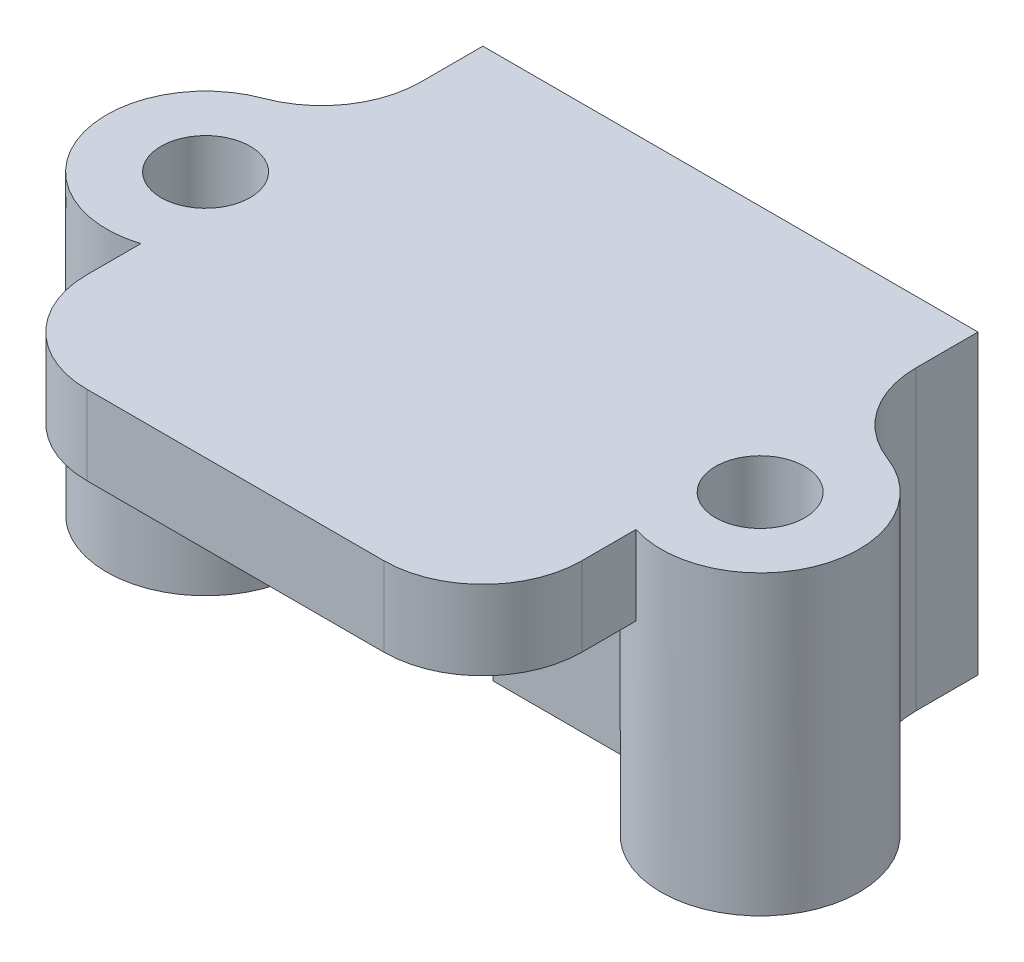
ISO-10303-21;
HEADER;
FILE_DESCRIPTION(('STEP AP214'),'2;1');
FILE_NAME('part.step','',(''),(''),'','','');
FILE_SCHEMA(('AUTOMOTIVE_DESIGN { 1 0 10303 214 1 1 1 1 }'));
ENDSEC;
DATA;
#1=APPLICATION_CONTEXT('core data for automotive mechanical design processes');
#2=APPLICATION_PROTOCOL_DEFINITION('international standard','automotive_design',2000,#1);
#3=PRODUCT_CONTEXT('',#1,'mechanical');
#4=PRODUCT('Part','Part','',(#3));
#5=PRODUCT_RELATED_PRODUCT_CATEGORY('part','',(#4));
#6=PRODUCT_DEFINITION_FORMATION('','',#4);
#7=PRODUCT_DEFINITION_CONTEXT('part definition',#1,'design');
#8=PRODUCT_DEFINITION('design','',#6,#7);
#9=PRODUCT_DEFINITION_SHAPE('','',#8);
#10=(LENGTH_UNIT() NAMED_UNIT(*) SI_UNIT(.MILLI.,.METRE.));
#11=(NAMED_UNIT(*) PLANE_ANGLE_UNIT() SI_UNIT($,.RADIAN.));
#12=(NAMED_UNIT(*) SI_UNIT($,.STERADIAN.) SOLID_ANGLE_UNIT());
#13=UNCERTAINTY_MEASURE_WITH_UNIT(LENGTH_MEASURE(1.E-05),#10,'distance_accuracy_value','');
#14=(GEOMETRIC_REPRESENTATION_CONTEXT(3) GLOBAL_UNCERTAINTY_ASSIGNED_CONTEXT((#13)) GLOBAL_UNIT_ASSIGNED_CONTEXT((#10,
#11,#12)) REPRESENTATION_CONTEXT('',''));
#15=CARTESIAN_POINT('',(0.,0.,0.));
#16=DIRECTION('',(0.,0.,1.));
#17=DIRECTION('',(1.,0.,0.));
#18=AXIS2_PLACEMENT_3D('',#15,#16,#17);
#19=CARTESIAN_POINT('',(-14.,-15.,0.));
#20=DIRECTION('',(0.,1.,0.));
#21=DIRECTION('',(0.,0.,1.));
#22=AXIS2_PLACEMENT_3D('',#19,#20,#21);
#23=CYLINDRICAL_SURFACE('',#22,5.);
#24=CARTESIAN_POINT('',(-14.,0.,0.));
#25=DIRECTION('',(0.,1.,0.));
#26=DIRECTION('',(0.,0.,1.));
#27=AXIS2_PLACEMENT_3D('',#24,#25,#26);
#28=CIRCLE('',#27,5.);
#29=CARTESIAN_POINT('',(-15.75,0.,-4.6837484987988));
#30=VERTEX_POINT('',#29);
#31=CARTESIAN_POINT('',(-12.5,0.,4.76969600708473));
#32=VERTEX_POINT('',#31);
#33=EDGE_CURVE('E283',#30,#32,#28,.T.);
#34=ORIENTED_EDGE('',*,*,#33,.F.);
#35=DIRECTION('',(0.,1.,0.));
#36=VECTOR('',#35,1.);
#37=CARTESIAN_POINT('',(-15.75,-15.,-4.6837484987988));
#38=LINE('',#37,#36);
#39=CARTESIAN_POINT('',(-15.75,-15.,-4.6837484987988));
#40=VERTEX_POINT('',#39);
#41=EDGE_CURVE('E48',#30,#40,#38,.F.);
#42=ORIENTED_EDGE('',*,*,#41,.T.);
#43=CARTESIAN_POINT('',(-14.,-15.,0.));
#44=DIRECTION('',(0.,1.,0.));
#45=DIRECTION('',(0.,0.,1.));
#46=AXIS2_PLACEMENT_3D('',#43,#44,#45);
#47=CIRCLE('',#46,5.);
#48=CARTESIAN_POINT('',(-9.,-15.,0.));
#49=VERTEX_POINT('',#48);
#50=EDGE_CURVE('E284',#40,#49,#47,.T.);
#51=ORIENTED_EDGE('',*,*,#50,.T.);
#52=DIRECTION('',(0.,1.,0.));
#53=VECTOR('',#52,1.);
#54=CARTESIAN_POINT('',(-9.,-15.,0.));
#55=LINE('',#54,#53);
#56=CARTESIAN_POINT('',(-9.,-5.5,0.));
#57=VERTEX_POINT('',#56);
#58=EDGE_CURVE('E269',#49,#57,#55,.T.);
#59=ORIENTED_EDGE('',*,*,#58,.T.);
#60=CARTESIAN_POINT('',(-14.,-5.5,0.));
#61=DIRECTION('',(0.,-1.,0.));
#62=DIRECTION('',(0.,0.,-1.));
#63=AXIS2_PLACEMENT_3D('',#60,#61,#62);
#64=CIRCLE('',#63,5.);
#65=CARTESIAN_POINT('',(-11.,-5.5,4.));
#66=VERTEX_POINT('',#65);
#67=EDGE_CURVE('E217',#66,#57,#64,.F.);
#68=ORIENTED_EDGE('',*,*,#67,.F.);
#69=DIRECTION('',(0.,1.,0.));
#70=VECTOR('',#69,1.);
#71=CARTESIAN_POINT('',(-11.,-15.,4.));
#72=LINE('',#71,#70);
#73=CARTESIAN_POINT('',(-11.,-4.,4.));
#74=VERTEX_POINT('',#73);
#75=EDGE_CURVE('E325',#66,#74,#72,.T.);
#76=ORIENTED_EDGE('',*,*,#75,.T.);
#77=CARTESIAN_POINT('',(-14.,-4.,0.));
#78=DIRECTION('',(0.,1.,0.));
#79=DIRECTION('',(0.,0.,1.));
#80=AXIS2_PLACEMENT_3D('',#77,#78,#79);
#81=CIRCLE('',#80,5.);
#82=CARTESIAN_POINT('',(-12.5,-4.,4.76969600708473));
#83=VERTEX_POINT('',#82);
#84=EDGE_CURVE('E286',#83,#74,#81,.T.);
#85=ORIENTED_EDGE('',*,*,#84,.F.);
#86=DIRECTION('',(0.,1.,0.));
#87=VECTOR('',#86,1.);
#88=CARTESIAN_POINT('',(-12.5,-15.,4.76969600708473));
#89=LINE('',#88,#87);
#90=EDGE_CURVE('E291',#32,#83,#89,.F.);
#91=ORIENTED_EDGE('',*,*,#90,.F.);
#92=EDGE_LOOP('',(#34,#42,#51,#59,#68,#76,#85,#91));
#93=FACE_BOUND('',#92,.T.);
#94=ADVANCED_FACE('F33',(#93),#23,.T.);
#95=CARTESIAN_POINT('',(14.,-15.,0.));
#96=DIRECTION('',(0.,1.,0.));
#97=DIRECTION('',(0.,0.,1.));
#98=AXIS2_PLACEMENT_3D('',#95,#96,#97);
#99=CYLINDRICAL_SURFACE('',#98,4.99999999999999);
#100=CARTESIAN_POINT('',(14.,-15.,0.));
#101=DIRECTION('',(0.,1.,0.));
#102=DIRECTION('',(0.,0.,1.));
#103=AXIS2_PLACEMENT_3D('',#100,#101,#102);
#104=CIRCLE('',#103,4.99999999999999);
#105=CARTESIAN_POINT('',(9.00000000000001,-15.,0.));
#106=VERTEX_POINT('',#105);
#107=CARTESIAN_POINT('',(15.75,-15.,-4.68374849879879));
#108=VERTEX_POINT('',#107);
#109=EDGE_CURVE('E273',#106,#108,#104,.T.);
#110=ORIENTED_EDGE('',*,*,#109,.T.);
#111=DIRECTION('',(0.,1.,0.));
#112=VECTOR('',#111,1.);
#113=CARTESIAN_POINT('',(15.75,-15.,-4.68374849879879));
#114=LINE('',#113,#112);
#115=CARTESIAN_POINT('',(15.75,0.,-4.68374849879879));
#116=VERTEX_POINT('',#115);
#117=EDGE_CURVE('E349',#108,#116,#114,.T.);
#118=ORIENTED_EDGE('',*,*,#117,.T.);
#119=CARTESIAN_POINT('',(14.,0.,0.));
#120=DIRECTION('',(0.,1.,0.));
#121=DIRECTION('',(0.,0.,1.));
#122=AXIS2_PLACEMENT_3D('',#119,#120,#121);
#123=CIRCLE('',#122,4.99999999999999);
#124=CARTESIAN_POINT('',(12.5,0.,4.76969600708472));
#125=VERTEX_POINT('',#124);
#126=EDGE_CURVE('E272',#125,#116,#123,.T.);
#127=ORIENTED_EDGE('',*,*,#126,.F.);
#128=DIRECTION('',(0.,1.,0.));
#129=VECTOR('',#128,1.);
#130=CARTESIAN_POINT('',(12.5,-15.,4.76969600708472));
#131=LINE('',#130,#129);
#132=CARTESIAN_POINT('',(12.5,-4.,4.76969600708472));
#133=VERTEX_POINT('',#132);
#134=EDGE_CURVE('E280',#133,#125,#131,.T.);
#135=ORIENTED_EDGE('',*,*,#134,.F.);
#136=CARTESIAN_POINT('',(14.,-4.,0.));
#137=DIRECTION('',(0.,1.,0.));
#138=DIRECTION('',(0.,0.,1.));
#139=AXIS2_PLACEMENT_3D('',#136,#137,#138);
#140=CIRCLE('',#139,4.99999999999999);
#141=CARTESIAN_POINT('',(11.,-4.,3.99999999999999));
#142=VERTEX_POINT('',#141);
#143=EDGE_CURVE('E276',#142,#133,#140,.T.);
#144=ORIENTED_EDGE('',*,*,#143,.F.);
#145=DIRECTION('',(0.,1.,0.));
#146=VECTOR('',#145,1.);
#147=CARTESIAN_POINT('',(11.,-15.,3.99999999999999));
#148=LINE('',#147,#146);
#149=CARTESIAN_POINT('',(11.,-5.5,3.99999999999999));
#150=VERTEX_POINT('',#149);
#151=EDGE_CURVE('E323',#142,#150,#148,.F.);
#152=ORIENTED_EDGE('',*,*,#151,.T.);
#153=CARTESIAN_POINT('',(14.,-5.5,0.));
#154=DIRECTION('',(0.,-1.,0.));
#155=DIRECTION('',(0.,0.,-1.));
#156=AXIS2_PLACEMENT_3D('',#153,#154,#155);
#157=CIRCLE('',#156,4.99999999999999);
#158=CARTESIAN_POINT('',(9.00000000000001,-5.5,0.));
#159=VERTEX_POINT('',#158);
#160=EDGE_CURVE('E187',#159,#150,#157,.F.);
#161=ORIENTED_EDGE('',*,*,#160,.F.);
#162=DIRECTION('',(0.,1.,0.));
#163=VECTOR('',#162,1.);
#164=CARTESIAN_POINT('',(9.00000000000001,-15.,0.));
#165=LINE('',#164,#163);
#166=EDGE_CURVE('E267',#159,#106,#165,.F.);
#167=ORIENTED_EDGE('',*,*,#166,.T.);
#168=EDGE_LOOP('',(#110,#118,#127,#135,#144,#152,#161,#167));
#169=FACE_BOUND('',#168,.T.);
#170=ADVANCED_FACE('F386',(#169),#99,.T.);
#171=CARTESIAN_POINT('',(-12.5,-15.,0.));
#172=DIRECTION('',(0.,0.,-1.));
#173=DIRECTION('',(-1.,0.,0.));
#174=AXIS2_PLACEMENT_3D('',#171,#172,#173);
#175=PLANE('',#174);
#176=ORIENTED_EDGE('',*,*,#166,.F.);
#177=DIRECTION('',(-1.,0.,0.));
#178=VECTOR('',#177,1.);
#179=CARTESIAN_POINT('',(-12.5,-5.5,0.));
#180=LINE('',#179,#178);
#181=CARTESIAN_POINT('',(0.500000000000001,-5.5,0.));
#182=VERTEX_POINT('',#181);
#183=EDGE_CURVE('E222',#159,#182,#180,.T.);
#184=ORIENTED_EDGE('',*,*,#183,.T.);
#185=DIRECTION('',(0.,-1.,0.));
#186=VECTOR('',#185,1.);
#187=CARTESIAN_POINT('',(0.500000000000001,3.07106781186548,0.));
#188=LINE('',#187,#186);
#189=CARTESIAN_POINT('',(0.500000000000001,-15.,0.));
#190=VERTEX_POINT('',#189);
#191=EDGE_CURVE('E239',#182,#190,#188,.T.);
#192=ORIENTED_EDGE('',*,*,#191,.T.);
#193=DIRECTION('',(-1.,0.,0.));
#194=VECTOR('',#193,1.);
#195=CARTESIAN_POINT('',(-12.5,-15.,0.));
#196=LINE('',#195,#194);
#197=EDGE_CURVE('E264',#106,#190,#196,.T.);
#198=ORIENTED_EDGE('',*,*,#197,.F.);
#199=EDGE_LOOP('',(#176,#184,#192,#198));
#200=FACE_BOUND('',#199,.T.);
#201=ADVANCED_FACE('F389',(#200),#175,.F.);
#202=CARTESIAN_POINT('',(0.,-4.,0.));
#203=DIRECTION('',(0.,1.,0.));
#204=DIRECTION('',(0.,0.,1.));
#205=AXIS2_PLACEMENT_3D('',#202,#203,#204);
#206=PLANE('',#205);
#207=DIRECTION('',(0.,0.,1.));
#208=VECTOR('',#207,1.);
#209=CARTESIAN_POINT('',(12.5,-4.,-12.5));
#210=LINE('',#209,#208);
#211=CARTESIAN_POINT('',(12.5,-4.,7.5));
#212=VERTEX_POINT('',#211);
#213=EDGE_CURVE('E295',#133,#212,#210,.T.);
#214=ORIENTED_EDGE('',*,*,#213,.T.);
#215=CARTESIAN_POINT('',(7.5,-4.,7.5));
#216=DIRECTION('',(0.,1.,0.));
#217=DIRECTION('',(0.,0.,1.));
#218=AXIS2_PLACEMENT_3D('',#215,#216,#217);
#219=CIRCLE('',#218,5.);
#220=CARTESIAN_POINT('',(7.5,-4.,12.5));
#221=VERTEX_POINT('',#220);
#222=EDGE_CURVE('E341',#212,#221,#219,.F.);
#223=ORIENTED_EDGE('',*,*,#222,.T.);
#224=DIRECTION('',(-1.,0.,0.));
#225=VECTOR('',#224,1.);
#226=CARTESIAN_POINT('',(-12.5,-4.,12.5));
#227=LINE('',#226,#225);
#228=CARTESIAN_POINT('',(-7.5,-4.,12.5));
#229=VERTEX_POINT('',#228);
#230=EDGE_CURVE('E298',#221,#229,#227,.T.);
#231=ORIENTED_EDGE('',*,*,#230,.T.);
#232=CARTESIAN_POINT('',(-7.5,-4.,7.5));
#233=DIRECTION('',(0.,1.,0.));
#234=DIRECTION('',(0.,0.,1.));
#235=AXIS2_PLACEMENT_3D('',#232,#233,#234);
#236=CIRCLE('',#235,5.);
#237=CARTESIAN_POINT('',(-12.5,-4.,7.5));
#238=VERTEX_POINT('',#237);
#239=EDGE_CURVE('E339',#229,#238,#236,.F.);
#240=ORIENTED_EDGE('',*,*,#239,.T.);
#241=DIRECTION('',(0.,0.,-1.));
#242=VECTOR('',#241,1.);
#243=CARTESIAN_POINT('',(-12.5,-4.,-12.5));
#244=LINE('',#243,#242);
#245=EDGE_CURVE('E302',#238,#83,#244,.T.);
#246=ORIENTED_EDGE('',*,*,#245,.T.);
#247=ORIENTED_EDGE('',*,*,#84,.T.);
#248=DIRECTION('',(0.,0.,-1.));
#249=VECTOR('',#248,1.);
#250=CARTESIAN_POINT('',(-11.,-4.,0.));
#251=LINE('',#250,#249);
#252=CARTESIAN_POINT('',(-11.,-4.,0.));
#253=VERTEX_POINT('',#252);
#254=EDGE_CURVE('E202',#74,#253,#251,.T.);
#255=ORIENTED_EDGE('',*,*,#254,.T.);
#256=CARTESIAN_POINT('',(0.,-4.,0.));
#257=DIRECTION('',(0.,-1.,0.));
#258=DIRECTION('',(0.,0.,-1.));
#259=AXIS2_PLACEMENT_3D('',#256,#257,#258);
#260=CIRCLE('',#259,11.);
#261=CARTESIAN_POINT('',(11.,-4.,0.));
#262=VERTEX_POINT('',#261);
#263=EDGE_CURVE('E412',#253,#262,#260,.T.);
#264=ORIENTED_EDGE('',*,*,#263,.T.);
#265=DIRECTION('',(0.,0.,1.));
#266=VECTOR('',#265,1.);
#267=CARTESIAN_POINT('',(11.,-4.,12.5));
#268=LINE('',#267,#266);
#269=EDGE_CURVE('E206',#262,#142,#268,.T.);
#270=ORIENTED_EDGE('',*,*,#269,.T.);
#271=ORIENTED_EDGE('',*,*,#143,.T.);
#272=EDGE_LOOP('',(#214,#223,#231,#240,#246,#247,#255,#264,#270,#271));
#273=FACE_BOUND('',#272,.T.);
#274=ADVANCED_FACE('F415',(#273),#206,.F.);
#275=CARTESIAN_POINT('',(12.5,-4.,-12.5));
#276=DIRECTION('',(-1.,0.,0.));
#277=DIRECTION('',(0.,0.,1.));
#278=AXIS2_PLACEMENT_3D('',#275,#276,#277);
#279=PLANE('',#278);
#280=DIRECTION('',(0.,0.,1.));
#281=VECTOR('',#280,1.);
#282=CARTESIAN_POINT('',(12.5,0.,-12.5));
#283=LINE('',#282,#281);
#284=CARTESIAN_POINT('',(12.5,0.,7.5));
#285=VERTEX_POINT('',#284);
#286=EDGE_CURVE('E294',#125,#285,#283,.T.);
#287=ORIENTED_EDGE('',*,*,#286,.T.);
#288=DIRECTION('',(0.,1.,0.));
#289=VECTOR('',#288,1.);
#290=CARTESIAN_POINT('',(12.5,-4.,7.5));
#291=LINE('',#290,#289);
#292=EDGE_CURVE('E337',#285,#212,#291,.F.);
#293=ORIENTED_EDGE('',*,*,#292,.T.);
#294=ORIENTED_EDGE('',*,*,#213,.F.);
#295=ORIENTED_EDGE('',*,*,#134,.T.);
#296=EDGE_LOOP('',(#287,#293,#294,#295));
#297=FACE_BOUND('',#296,.T.);
#298=ADVANCED_FACE('F436',(#297),#279,.F.);
#299=CARTESIAN_POINT('',(-12.5,-4.,-12.5));
#300=DIRECTION('',(1.,0.,0.));
#301=DIRECTION('',(0.,0.,-1.));
#302=AXIS2_PLACEMENT_3D('',#299,#300,#301);
#303=PLANE('',#302);
#304=DIRECTION('',(0.,0.,-1.));
#305=VECTOR('',#304,1.);
#306=CARTESIAN_POINT('',(-12.5,-15.,0.));
#307=LINE('',#306,#305);
#308=CARTESIAN_POINT('',(-12.5,-15.,-9.36749699759759));
#309=VERTEX_POINT('',#308);
#310=CARTESIAN_POINT('',(-12.5,-15.,-12.5));
#311=VERTEX_POINT('',#310);
#312=EDGE_CURVE('E253',#309,#311,#307,.T.);
#313=ORIENTED_EDGE('',*,*,#312,.F.);
#314=DIRECTION('',(0.,1.,0.));
#315=VECTOR('',#314,1.);
#316=CARTESIAN_POINT('',(-12.5,-4.,-9.36749699759759));
#317=LINE('',#316,#315);
#318=CARTESIAN_POINT('',(-12.5,0.,-9.36749699759759));
#319=VERTEX_POINT('',#318);
#320=EDGE_CURVE('E351',#309,#319,#317,.T.);
#321=ORIENTED_EDGE('',*,*,#320,.T.);
#322=DIRECTION('',(0.,0.,-1.));
#323=VECTOR('',#322,1.);
#324=CARTESIAN_POINT('',(-12.5,0.,-12.5));
#325=LINE('',#324,#323);
#326=CARTESIAN_POINT('',(-12.5,0.,-12.5));
#327=VERTEX_POINT('',#326);
#328=EDGE_CURVE('E311',#319,#327,#325,.T.);
#329=ORIENTED_EDGE('',*,*,#328,.T.);
#330=DIRECTION('',(0.,1.,0.));
#331=VECTOR('',#330,1.);
#332=CARTESIAN_POINT('',(-12.5,-4.,-12.5));
#333=LINE('',#332,#331);
#334=EDGE_CURVE('E317',#311,#327,#333,.T.);
#335=ORIENTED_EDGE('',*,*,#334,.F.);
#336=EDGE_LOOP('',(#313,#321,#329,#335));
#337=FACE_BOUND('',#336,.T.);
#338=ADVANCED_FACE('F369',(#337),#303,.F.);
#339=CARTESIAN_POINT('',(12.5,0.,-12.5));
#340=VERTEX_POINT('',#339);
#341=CARTESIAN_POINT('',(12.5,0.,-9.36749699759759));
#342=VERTEX_POINT('',#341);
#343=EDGE_CURVE('E305',#340,#342,#283,.T.);
#344=ORIENTED_EDGE('',*,*,#343,.T.);
#345=DIRECTION('',(0.,1.,0.));
#346=VECTOR('',#345,1.);
#347=CARTESIAN_POINT('',(12.5,-4.,-9.36749699759759));
#348=LINE('',#347,#346);
#349=CARTESIAN_POINT('',(12.5,-15.,-9.36749699759759));
#350=VERTEX_POINT('',#349);
#351=EDGE_CURVE('E346',#342,#350,#348,.F.);
#352=ORIENTED_EDGE('',*,*,#351,.T.);
#353=DIRECTION('',(0.,0.,1.));
#354=VECTOR('',#353,1.);
#355=CARTESIAN_POINT('',(12.5,-15.,-12.5));
#356=LINE('',#355,#354);
#357=CARTESIAN_POINT('',(12.5,-15.,-12.5));
#358=VERTEX_POINT('',#357);
#359=EDGE_CURVE('E260',#358,#350,#356,.T.);
#360=ORIENTED_EDGE('',*,*,#359,.F.);
#361=DIRECTION('',(0.,1.,0.));
#362=VECTOR('',#361,1.);
#363=CARTESIAN_POINT('',(12.5,-4.,-12.5));
#364=LINE('',#363,#362);
#365=EDGE_CURVE('E304',#358,#340,#364,.T.);
#366=ORIENTED_EDGE('',*,*,#365,.T.);
#367=EDGE_LOOP('',(#344,#352,#360,#366));
#368=FACE_BOUND('',#367,.T.);
#369=ADVANCED_FACE('F376',(#368),#279,.F.);
#370=CARTESIAN_POINT('',(-12.5,-4.,12.5));
#371=DIRECTION('',(0.,0.,-1.));
#372=DIRECTION('',(-1.,0.,0.));
#373=AXIS2_PLACEMENT_3D('',#370,#371,#372);
#374=PLANE('',#373);
#375=ORIENTED_EDGE('',*,*,#230,.F.);
#376=DIRECTION('',(0.,1.,0.));
#377=VECTOR('',#376,1.);
#378=CARTESIAN_POINT('',(7.5,-4.,12.5));
#379=LINE('',#378,#377);
#380=CARTESIAN_POINT('',(7.5,0.,12.5));
#381=VERTEX_POINT('',#380);
#382=EDGE_CURVE('E330',#221,#381,#379,.T.);
#383=ORIENTED_EDGE('',*,*,#382,.T.);
#384=DIRECTION('',(-1.,0.,0.));
#385=VECTOR('',#384,1.);
#386=CARTESIAN_POINT('',(-12.5,0.,12.5));
#387=LINE('',#386,#385);
#388=CARTESIAN_POINT('',(-7.5,0.,12.5));
#389=VERTEX_POINT('',#388);
#390=EDGE_CURVE('E308',#381,#389,#387,.T.);
#391=ORIENTED_EDGE('',*,*,#390,.T.);
#392=DIRECTION('',(0.,1.,0.));
#393=VECTOR('',#392,1.);
#394=CARTESIAN_POINT('',(-7.5,-4.,12.5));
#395=LINE('',#394,#393);
#396=EDGE_CURVE('E328',#389,#229,#395,.F.);
#397=ORIENTED_EDGE('',*,*,#396,.T.);
#398=EDGE_LOOP('',(#375,#383,#391,#397));
#399=FACE_BOUND('',#398,.T.);
#400=ADVANCED_FACE('F446',(#399),#374,.F.);
#401=ORIENTED_EDGE('',*,*,#245,.F.);
#402=DIRECTION('',(0.,1.,0.));
#403=VECTOR('',#402,1.);
#404=CARTESIAN_POINT('',(-12.5,-4.,7.5));
#405=LINE('',#404,#403);
#406=CARTESIAN_POINT('',(-12.5,0.,7.5));
#407=VERTEX_POINT('',#406);
#408=EDGE_CURVE('E343',#238,#407,#405,.T.);
#409=ORIENTED_EDGE('',*,*,#408,.T.);
#410=EDGE_CURVE('E312',#407,#32,#325,.T.);
#411=ORIENTED_EDGE('',*,*,#410,.T.);
#412=ORIENTED_EDGE('',*,*,#90,.T.);
#413=EDGE_LOOP('',(#401,#409,#411,#412));
#414=FACE_BOUND('',#413,.T.);
#415=ADVANCED_FACE('F443',(#414),#303,.F.);
#416=CARTESIAN_POINT('',(-12.5,-4.,-12.5));
#417=DIRECTION('',(0.,0.,1.));
#418=DIRECTION('',(1.,0.,0.));
#419=AXIS2_PLACEMENT_3D('',#416,#417,#418);
#420=PLANE('',#419);
#421=DIRECTION('',(1.,0.,0.));
#422=VECTOR('',#421,1.);
#423=CARTESIAN_POINT('',(-12.5,0.,-12.5));
#424=LINE('',#423,#422);
#425=EDGE_CURVE('E299',#327,#340,#424,.T.);
#426=ORIENTED_EDGE('',*,*,#425,.T.);
#427=ORIENTED_EDGE('',*,*,#365,.F.);
#428=DIRECTION('',(1.,0.,0.));
#429=VECTOR('',#428,1.);
#430=CARTESIAN_POINT('',(-12.5,-15.,-12.5));
#431=LINE('',#430,#429);
#432=EDGE_CURVE('E257',#311,#358,#431,.T.);
#433=ORIENTED_EDGE('',*,*,#432,.F.);
#434=ORIENTED_EDGE('',*,*,#334,.T.);
#435=EDGE_LOOP('',(#426,#427,#433,#434));
#436=FACE_BOUND('',#435,.T.);
#437=ADVANCED_FACE('F439',(#436),#420,.F.);
#438=CARTESIAN_POINT('',(0.,0.,0.));
#439=DIRECTION('',(0.,1.,0.));
#440=DIRECTION('',(0.,0.,1.));
#441=AXIS2_PLACEMENT_3D('',#438,#439,#440);
#442=PLANE('',#441);
#443=CARTESIAN_POINT('',(14.,0.,0.));
#444=DIRECTION('',(0.,1.,0.));
#445=DIRECTION('',(0.,0.,1.));
#446=AXIS2_PLACEMENT_3D('',#443,#444,#445);
#447=CIRCLE('',#446,2.25);
#448=CARTESIAN_POINT('',(14.,0.,2.25));
#449=VERTEX_POINT('',#448);
#450=EDGE_CURVE('E243',#449,#449,#447,.T.);
#451=ORIENTED_EDGE('',*,*,#450,.F.);
#452=EDGE_LOOP('',(#451));
#453=FACE_BOUND('',#452,.T.);
#454=CARTESIAN_POINT('',(-14.,0.,0.));
#455=DIRECTION('',(0.,1.,0.));
#456=DIRECTION('',(0.,0.,1.));
#457=AXIS2_PLACEMENT_3D('',#454,#455,#456);
#458=CIRCLE('',#457,2.25);
#459=CARTESIAN_POINT('',(-14.,0.,2.25));
#460=VERTEX_POINT('',#459);
#461=EDGE_CURVE('E247',#460,#460,#458,.T.);
#462=ORIENTED_EDGE('',*,*,#461,.F.);
#463=EDGE_LOOP('',(#462));
#464=FACE_BOUND('',#463,.T.);
#465=ORIENTED_EDGE('',*,*,#390,.F.);
#466=CARTESIAN_POINT('',(7.5,0.,7.5));
#467=DIRECTION('',(0.,1.,0.));
#468=DIRECTION('',(0.,0.,1.));
#469=AXIS2_PLACEMENT_3D('',#466,#467,#468);
#470=CIRCLE('',#469,5.);
#471=EDGE_CURVE('E335',#381,#285,#470,.T.);
#472=ORIENTED_EDGE('',*,*,#471,.T.);
#473=ORIENTED_EDGE('',*,*,#286,.F.);
#474=ORIENTED_EDGE('',*,*,#126,.T.);
#475=CARTESIAN_POINT('',(17.5,0.,-9.36749699759759));
#476=DIRECTION('',(0.,1.,0.));
#477=DIRECTION('',(0.,0.,1.));
#478=AXIS2_PLACEMENT_3D('',#475,#476,#477);
#479=CIRCLE('',#478,5.);
#480=EDGE_CURVE('E357',#116,#342,#479,.F.);
#481=ORIENTED_EDGE('',*,*,#480,.T.);
#482=ORIENTED_EDGE('',*,*,#343,.F.);
#483=ORIENTED_EDGE('',*,*,#425,.F.);
#484=ORIENTED_EDGE('',*,*,#328,.F.);
#485=CARTESIAN_POINT('',(-17.5,0.,-9.36749699759759));
#486=DIRECTION('',(0.,1.,0.));
#487=DIRECTION('',(0.,0.,1.));
#488=AXIS2_PLACEMENT_3D('',#485,#486,#487);
#489=CIRCLE('',#488,5.);
#490=EDGE_CURVE('E41',#319,#30,#489,.F.);
#491=ORIENTED_EDGE('',*,*,#490,.T.);
#492=ORIENTED_EDGE('',*,*,#33,.T.);
#493=ORIENTED_EDGE('',*,*,#410,.F.);
#494=CARTESIAN_POINT('',(-7.5,0.,7.5));
#495=DIRECTION('',(0.,1.,0.));
#496=DIRECTION('',(0.,0.,1.));
#497=AXIS2_PLACEMENT_3D('',#494,#495,#496);
#498=CIRCLE('',#497,5.);
#499=EDGE_CURVE('E333',#407,#389,#498,.T.);
#500=ORIENTED_EDGE('',*,*,#499,.T.);
#501=EDGE_LOOP('',(#465,#472,#473,#474,#481,#482,#483,#484,#491,#492,#493,#500));
#502=FACE_BOUND('',#501,.T.);
#503=ADVANCED_FACE('F361',(#453,#464,#502),#442,.T.);
#504=CARTESIAN_POINT('',(-14.,-15.,0.));
#505=DIRECTION('',(0.,1.,0.));
#506=DIRECTION('',(0.,0.,1.));
#507=AXIS2_PLACEMENT_3D('',#504,#505,#506);
#508=PLANE('',#507);
#509=CARTESIAN_POINT('',(14.,-15.,0.));
#510=DIRECTION('',(0.,1.,0.));
#511=DIRECTION('',(0.,0.,1.));
#512=AXIS2_PLACEMENT_3D('',#509,#510,#511);
#513=CIRCLE('',#512,2.25);
#514=CARTESIAN_POINT('',(14.,-15.,2.25));
#515=VERTEX_POINT('',#514);
#516=EDGE_CURVE('E244',#515,#515,#513,.T.);
#517=ORIENTED_EDGE('',*,*,#516,.T.);
#518=EDGE_LOOP('',(#517));
#519=FACE_BOUND('',#518,.T.);
#520=CARTESIAN_POINT('',(-14.,-15.,0.));
#521=DIRECTION('',(0.,1.,0.));
#522=DIRECTION('',(0.,0.,1.));
#523=AXIS2_PLACEMENT_3D('',#520,#521,#522);
#524=CIRCLE('',#523,2.25);
#525=CARTESIAN_POINT('',(-14.,-15.,2.25));
#526=VERTEX_POINT('',#525);
#527=EDGE_CURVE('E250',#526,#526,#524,.T.);
#528=ORIENTED_EDGE('',*,*,#527,.T.);
#529=EDGE_LOOP('',(#528));
#530=FACE_BOUND('',#529,.T.);
#531=ORIENTED_EDGE('',*,*,#197,.T.);
#532=DIRECTION('',(0.,0.,1.));
#533=VECTOR('',#532,1.);
#534=CARTESIAN_POINT('',(0.500000000000001,-15.,0.));
#535=LINE('',#534,#533);
#536=CARTESIAN_POINT('',(0.5,-15.,-7.));
#537=VERTEX_POINT('',#536);
#538=EDGE_CURVE('E227',#537,#190,#535,.T.);
#539=ORIENTED_EDGE('',*,*,#538,.F.);
#540=DIRECTION('',(1.,0.,0.));
#541=VECTOR('',#540,1.);
#542=CARTESIAN_POINT('',(-0.5,-15.,-7.));
#543=LINE('',#542,#541);
#544=CARTESIAN_POINT('',(-0.5,-15.,-7.));
#545=VERTEX_POINT('',#544);
#546=EDGE_CURVE('E231',#545,#537,#543,.T.);
#547=ORIENTED_EDGE('',*,*,#546,.F.);
#548=DIRECTION('',(0.,0.,-1.));
#549=VECTOR('',#548,1.);
#550=CARTESIAN_POINT('',(-0.500000000000001,-15.,0.));
#551=LINE('',#550,#549);
#552=CARTESIAN_POINT('',(-0.500000000000001,-15.,0.));
#553=VERTEX_POINT('',#552);
#554=EDGE_CURVE('E226',#553,#545,#551,.T.);
#555=ORIENTED_EDGE('',*,*,#554,.F.);
#556=EDGE_CURVE('E263',#553,#49,#196,.T.);
#557=ORIENTED_EDGE('',*,*,#556,.T.);
#558=ORIENTED_EDGE('',*,*,#50,.F.);
#559=CARTESIAN_POINT('',(-17.5,-15.,-9.36749699759759));
#560=DIRECTION('',(0.,1.,0.));
#561=DIRECTION('',(0.,0.,1.));
#562=AXIS2_PLACEMENT_3D('',#559,#560,#561);
#563=CIRCLE('',#562,5.);
#564=EDGE_CURVE('E11',#40,#309,#563,.T.);
#565=ORIENTED_EDGE('',*,*,#564,.T.);
#566=ORIENTED_EDGE('',*,*,#312,.T.);
#567=ORIENTED_EDGE('',*,*,#432,.T.);
#568=ORIENTED_EDGE('',*,*,#359,.T.);
#569=CARTESIAN_POINT('',(17.5,-15.,-9.36749699759759));
#570=DIRECTION('',(0.,1.,0.));
#571=DIRECTION('',(0.,0.,1.));
#572=AXIS2_PLACEMENT_3D('',#569,#570,#571);
#573=CIRCLE('',#572,5.);
#574=EDGE_CURVE('E355',#350,#108,#573,.T.);
#575=ORIENTED_EDGE('',*,*,#574,.T.);
#576=ORIENTED_EDGE('',*,*,#109,.F.);
#577=EDGE_LOOP('',(#531,#539,#547,#555,#557,#558,#565,#566,#567,#568,#575,#576));
#578=FACE_BOUND('',#577,.T.);
#579=ADVANCED_FACE('F372',(#519,#530,#578),#508,.F.);
#580=DIRECTION('',(0.,-1.,0.));
#581=VECTOR('',#580,1.);
#582=CARTESIAN_POINT('',(-0.500000000000001,3.07106781186548,0.));
#583=LINE('',#582,#581);
#584=CARTESIAN_POINT('',(-0.500000000000001,-5.5,0.));
#585=VERTEX_POINT('',#584);
#586=EDGE_CURVE('E236',#585,#553,#583,.T.);
#587=ORIENTED_EDGE('',*,*,#586,.F.);
#588=DIRECTION('',(-1.,0.,0.));
#589=VECTOR('',#588,1.);
#590=CARTESIAN_POINT('',(-12.5,-5.5,0.));
#591=LINE('',#590,#589);
#592=EDGE_CURVE('E210',#585,#57,#591,.T.);
#593=ORIENTED_EDGE('',*,*,#592,.T.);
#594=ORIENTED_EDGE('',*,*,#58,.F.);
#595=ORIENTED_EDGE('',*,*,#556,.F.);
#596=EDGE_LOOP('',(#587,#593,#594,#595));
#597=FACE_BOUND('',#596,.T.);
#598=ADVANCED_FACE('F407',(#597),#175,.F.);
#599=CARTESIAN_POINT('',(-14.,-15.,0.));
#600=DIRECTION('',(0.,1.,0.));
#601=DIRECTION('',(0.,0.,1.));
#602=AXIS2_PLACEMENT_3D('',#599,#600,#601);
#603=CYLINDRICAL_SURFACE('',#602,2.25);
#604=ORIENTED_EDGE('',*,*,#527,.F.);
#605=EDGE_LOOP('',(#604));
#606=FACE_BOUND('',#605,.T.);
#607=ORIENTED_EDGE('',*,*,#461,.T.);
#608=EDGE_LOOP('',(#607));
#609=FACE_BOUND('',#608,.T.);
#610=ADVANCED_FACE('F612',(#606,#609),#603,.F.);
#611=CARTESIAN_POINT('',(14.,-15.,0.));
#612=DIRECTION('',(0.,1.,0.));
#613=DIRECTION('',(0.,0.,1.));
#614=AXIS2_PLACEMENT_3D('',#611,#612,#613);
#615=CYLINDRICAL_SURFACE('',#614,2.25);
#616=ORIENTED_EDGE('',*,*,#516,.F.);
#617=EDGE_LOOP('',(#616));
#618=FACE_BOUND('',#617,.T.);
#619=ORIENTED_EDGE('',*,*,#450,.T.);
#620=EDGE_LOOP('',(#619));
#621=FACE_BOUND('',#620,.T.);
#622=ADVANCED_FACE('F604',(#618,#621),#615,.F.);
#623=CARTESIAN_POINT('',(-0.5,3.07106781186548,-7.));
#624=DIRECTION('',(0.,0.,-1.));
#625=DIRECTION('',(-1.,0.,0.));
#626=AXIS2_PLACEMENT_3D('',#623,#624,#625);
#627=PLANE('',#626);
#628=DIRECTION('',(0.,-1.,0.));
#629=VECTOR('',#628,1.);
#630=CARTESIAN_POINT('',(0.5,3.07106781186548,-7.));
#631=LINE('',#630,#629);
#632=CARTESIAN_POINT('',(0.5,-5.5,-7.));
#633=VERTEX_POINT('',#632);
#634=EDGE_CURVE('E230',#633,#537,#631,.T.);
#635=ORIENTED_EDGE('',*,*,#634,.F.);
#636=DIRECTION('',(-1.,0.,0.));
#637=VECTOR('',#636,1.);
#638=CARTESIAN_POINT('',(-0.5,-5.5,-7.));
#639=LINE('',#638,#637);
#640=CARTESIAN_POINT('',(-0.5,-5.5,-7.));
#641=VERTEX_POINT('',#640);
#642=EDGE_CURVE('E207',#633,#641,#639,.T.);
#643=ORIENTED_EDGE('',*,*,#642,.T.);
#644=DIRECTION('',(0.,-1.,0.));
#645=VECTOR('',#644,1.);
#646=CARTESIAN_POINT('',(-0.5,3.07106781186548,-7.));
#647=LINE('',#646,#645);
#648=EDGE_CURVE('E238',#641,#545,#647,.T.);
#649=ORIENTED_EDGE('',*,*,#648,.T.);
#650=ORIENTED_EDGE('',*,*,#546,.T.);
#651=EDGE_LOOP('',(#635,#643,#649,#650));
#652=FACE_BOUND('',#651,.T.);
#653=ADVANCED_FACE('F398',(#652),#627,.F.);
#654=CARTESIAN_POINT('',(0.500000000000001,3.07106781186548,0.));
#655=DIRECTION('',(1.,0.,0.));
#656=DIRECTION('',(0.,0.,-1.));
#657=AXIS2_PLACEMENT_3D('',#654,#655,#656);
#658=PLANE('',#657);
#659=ORIENTED_EDGE('',*,*,#191,.F.);
#660=DIRECTION('',(0.,0.,-1.));
#661=VECTOR('',#660,1.);
#662=CARTESIAN_POINT('',(0.500000000000001,-5.5,0.));
#663=LINE('',#662,#661);
#664=EDGE_CURVE('E219',#182,#633,#663,.T.);
#665=ORIENTED_EDGE('',*,*,#664,.T.);
#666=ORIENTED_EDGE('',*,*,#634,.T.);
#667=ORIENTED_EDGE('',*,*,#538,.T.);
#668=EDGE_LOOP('',(#659,#665,#666,#667));
#669=FACE_BOUND('',#668,.T.);
#670=ADVANCED_FACE('F395',(#669),#658,.F.);
#671=CARTESIAN_POINT('',(-0.500000000000001,3.07106781186548,0.));
#672=DIRECTION('',(-1.,0.,0.));
#673=DIRECTION('',(0.,0.,1.));
#674=AXIS2_PLACEMENT_3D('',#671,#672,#673);
#675=PLANE('',#674);
#676=ORIENTED_EDGE('',*,*,#648,.F.);
#677=DIRECTION('',(0.,0.,1.));
#678=VECTOR('',#677,1.);
#679=CARTESIAN_POINT('',(-0.500000000000001,-5.5,0.));
#680=LINE('',#679,#678);
#681=EDGE_CURVE('E320',#641,#585,#680,.T.);
#682=ORIENTED_EDGE('',*,*,#681,.T.);
#683=ORIENTED_EDGE('',*,*,#586,.T.);
#684=ORIENTED_EDGE('',*,*,#554,.T.);
#685=EDGE_LOOP('',(#676,#682,#683,#684));
#686=FACE_BOUND('',#685,.T.);
#687=ADVANCED_FACE('F401',(#686),#675,.F.);
#688=CARTESIAN_POINT('',(0.,-5.5,0.));
#689=DIRECTION('',(0.,1.,0.));
#690=DIRECTION('',(0.,0.,1.));
#691=AXIS2_PLACEMENT_3D('',#688,#689,#690);
#692=CYLINDRICAL_SURFACE('',#691,11.);
#693=ORIENTED_EDGE('',*,*,#263,.F.);
#694=DIRECTION('',(0.,1.,0.));
#695=VECTOR('',#694,1.);
#696=CARTESIAN_POINT('',(-11.,-5.5,0.));
#697=LINE('',#696,#695);
#698=CARTESIAN_POINT('',(-11.,-5.5,0.));
#699=VERTEX_POINT('',#698);
#700=EDGE_CURVE('E201',#699,#253,#697,.T.);
#701=ORIENTED_EDGE('',*,*,#700,.F.);
#702=CARTESIAN_POINT('',(0.,-5.5,0.));
#703=DIRECTION('',(0.,-1.,0.));
#704=DIRECTION('',(0.,0.,-1.));
#705=AXIS2_PLACEMENT_3D('',#702,#703,#704);
#706=CIRCLE('',#705,11.);
#707=CARTESIAN_POINT('',(11.,-5.5,0.));
#708=VERTEX_POINT('',#707);
#709=EDGE_CURVE('E185',#699,#708,#706,.T.);
#710=ORIENTED_EDGE('',*,*,#709,.T.);
#711=DIRECTION('',(0.,1.,0.));
#712=VECTOR('',#711,1.);
#713=CARTESIAN_POINT('',(11.,-5.5,0.));
#714=LINE('',#713,#712);
#715=EDGE_CURVE('E198',#708,#262,#714,.T.);
#716=ORIENTED_EDGE('',*,*,#715,.T.);
#717=EDGE_LOOP('',(#693,#701,#710,#716));
#718=FACE_BOUND('',#717,.T.);
#719=ADVANCED_FACE('F197',(#718),#692,.F.);
#720=CARTESIAN_POINT('',(11.,-5.5,12.5));
#721=DIRECTION('',(-1.,0.,0.));
#722=DIRECTION('',(0.,0.,1.));
#723=AXIS2_PLACEMENT_3D('',#720,#721,#722);
#724=PLANE('',#723);
#725=ORIENTED_EDGE('',*,*,#269,.F.);
#726=ORIENTED_EDGE('',*,*,#715,.F.);
#727=DIRECTION('',(0.,0.,1.));
#728=VECTOR('',#727,1.);
#729=CARTESIAN_POINT('',(11.,-5.5,12.5));
#730=LINE('',#729,#728);
#731=EDGE_CURVE('E181',#708,#150,#730,.T.);
#732=ORIENTED_EDGE('',*,*,#731,.T.);
#733=ORIENTED_EDGE('',*,*,#151,.F.);
#734=EDGE_LOOP('',(#725,#726,#732,#733));
#735=FACE_BOUND('',#734,.T.);
#736=ADVANCED_FACE('F204',(#735),#724,.T.);
#737=CARTESIAN_POINT('',(-11.,-5.5,0.));
#738=DIRECTION('',(1.,0.,0.));
#739=DIRECTION('',(0.,0.,-1.));
#740=AXIS2_PLACEMENT_3D('',#737,#738,#739);
#741=PLANE('',#740);
#742=DIRECTION('',(0.,0.,-1.));
#743=VECTOR('',#742,1.);
#744=CARTESIAN_POINT('',(-11.,-5.5,0.));
#745=LINE('',#744,#743);
#746=EDGE_CURVE('E191',#66,#699,#745,.T.);
#747=ORIENTED_EDGE('',*,*,#746,.T.);
#748=ORIENTED_EDGE('',*,*,#700,.T.);
#749=ORIENTED_EDGE('',*,*,#254,.F.);
#750=ORIENTED_EDGE('',*,*,#75,.F.);
#751=EDGE_LOOP('',(#747,#748,#749,#750));
#752=FACE_BOUND('',#751,.T.);
#753=ADVANCED_FACE('F416',(#752),#741,.T.);
#754=CARTESIAN_POINT('',(0.,-5.5,0.));
#755=DIRECTION('',(0.,-1.,0.));
#756=DIRECTION('',(0.,0.,-1.));
#757=AXIS2_PLACEMENT_3D('',#754,#755,#756);
#758=PLANE('',#757);
#759=ORIENTED_EDGE('',*,*,#160,.T.);
#760=ORIENTED_EDGE('',*,*,#731,.F.);
#761=ORIENTED_EDGE('',*,*,#709,.F.);
#762=ORIENTED_EDGE('',*,*,#746,.F.);
#763=ORIENTED_EDGE('',*,*,#67,.T.);
#764=ORIENTED_EDGE('',*,*,#592,.F.);
#765=ORIENTED_EDGE('',*,*,#681,.F.);
#766=ORIENTED_EDGE('',*,*,#642,.F.);
#767=ORIENTED_EDGE('',*,*,#664,.F.);
#768=ORIENTED_EDGE('',*,*,#183,.F.);
#769=EDGE_LOOP('',(#759,#760,#761,#762,#763,#764,#765,#766,#767,#768));
#770=FACE_BOUND('',#769,.T.);
#771=ADVANCED_FACE('F183',(#770),#758,.F.);
#772=CARTESIAN_POINT('',(7.5,-4.,7.5));
#773=DIRECTION('',(0.,1.,0.));
#774=DIRECTION('',(0.,0.,1.));
#775=AXIS2_PLACEMENT_3D('',#772,#773,#774);
#776=CYLINDRICAL_SURFACE('',#775,5.);
#777=ORIENTED_EDGE('',*,*,#222,.F.);
#778=ORIENTED_EDGE('',*,*,#292,.F.);
#779=ORIENTED_EDGE('',*,*,#471,.F.);
#780=ORIENTED_EDGE('',*,*,#382,.F.);
#781=EDGE_LOOP('',(#777,#778,#779,#780));
#782=FACE_BOUND('',#781,.T.);
#783=ADVANCED_FACE('F423',(#782),#776,.T.);
#784=CARTESIAN_POINT('',(-7.5,-4.,7.5));
#785=DIRECTION('',(0.,1.,0.));
#786=DIRECTION('',(0.,0.,1.));
#787=AXIS2_PLACEMENT_3D('',#784,#785,#786);
#788=CYLINDRICAL_SURFACE('',#787,5.);
#789=ORIENTED_EDGE('',*,*,#239,.F.);
#790=ORIENTED_EDGE('',*,*,#396,.F.);
#791=ORIENTED_EDGE('',*,*,#499,.F.);
#792=ORIENTED_EDGE('',*,*,#408,.F.);
#793=EDGE_LOOP('',(#789,#790,#791,#792));
#794=FACE_BOUND('',#793,.T.);
#795=ADVANCED_FACE('F455',(#794),#788,.T.);
#796=CARTESIAN_POINT('',(17.5,-15.,-9.36749699759759));
#797=DIRECTION('',(0.,1.,0.));
#798=DIRECTION('',(0.,0.,1.));
#799=AXIS2_PLACEMENT_3D('',#796,#797,#798);
#800=CYLINDRICAL_SURFACE('',#799,5.);
#801=ORIENTED_EDGE('',*,*,#480,.F.);
#802=ORIENTED_EDGE('',*,*,#117,.F.);
#803=ORIENTED_EDGE('',*,*,#574,.F.);
#804=ORIENTED_EDGE('',*,*,#351,.F.);
#805=EDGE_LOOP('',(#801,#802,#803,#804));
#806=FACE_BOUND('',#805,.T.);
#807=ADVANCED_FACE('F381',(#806),#800,.F.);
#808=CARTESIAN_POINT('',(-17.5,-15.,-9.36749699759759));
#809=DIRECTION('',(0.,1.,0.));
#810=DIRECTION('',(0.,0.,1.));
#811=AXIS2_PLACEMENT_3D('',#808,#809,#810);
#812=CYLINDRICAL_SURFACE('',#811,5.);
#813=ORIENTED_EDGE('',*,*,#564,.F.);
#814=ORIENTED_EDGE('',*,*,#41,.F.);
#815=ORIENTED_EDGE('',*,*,#490,.F.);
#816=ORIENTED_EDGE('',*,*,#320,.F.);
#817=EDGE_LOOP('',(#813,#814,#815,#816));
#818=FACE_BOUND('',#817,.T.);
#819=ADVANCED_FACE('F35',(#818),#812,.F.);
#820=CLOSED_SHELL('',(#94,#170,#201,#274,#298,#338,#369,#400,#415,#437,#503,#579,#598,#610,#622,
#653,#670,#687,#719,#736,#753,#771,#783,#795,#807,#819));
#821=MANIFOLD_SOLID_BREP('B2',#820);
#822=ADVANCED_BREP_SHAPE_REPRESENTATION('',(#18,#821),#14);
#823=SHAPE_DEFINITION_REPRESENTATION(#9,#822);
ENDSEC;
END-ISO-10303-21;
